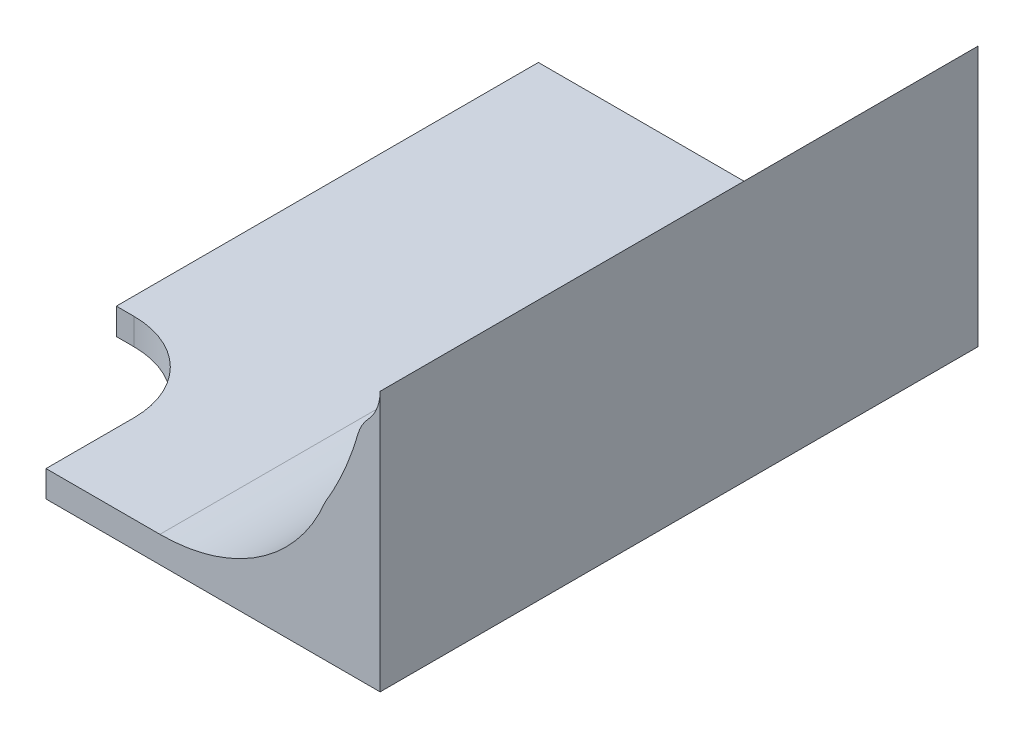
ISO-10303-21;
HEADER;
FILE_DESCRIPTION(('STEP AP214'),'2;1');
FILE_NAME('part.step','',(''),(''),'','','');
FILE_SCHEMA(('AUTOMOTIVE_DESIGN { 1 0 10303 214 1 1 1 1 }'));
ENDSEC;
DATA;
#1=APPLICATION_CONTEXT('core data for automotive mechanical design processes');
#2=APPLICATION_PROTOCOL_DEFINITION('international standard','automotive_design',2000,#1);
#3=PRODUCT_CONTEXT('',#1,'mechanical');
#4=PRODUCT('Part','Part','',(#3));
#5=PRODUCT_RELATED_PRODUCT_CATEGORY('part','',(#4));
#6=PRODUCT_DEFINITION_FORMATION('','',#4);
#7=PRODUCT_DEFINITION_CONTEXT('part definition',#1,'design');
#8=PRODUCT_DEFINITION('design','',#6,#7);
#9=PRODUCT_DEFINITION_SHAPE('','',#8);
#10=(LENGTH_UNIT() NAMED_UNIT(*) SI_UNIT(.MILLI.,.METRE.));
#11=(NAMED_UNIT(*) PLANE_ANGLE_UNIT() SI_UNIT($,.RADIAN.));
#12=(NAMED_UNIT(*) SI_UNIT($,.STERADIAN.) SOLID_ANGLE_UNIT());
#13=UNCERTAINTY_MEASURE_WITH_UNIT(LENGTH_MEASURE(1.E-05),#10,'distance_accuracy_value','');
#14=(GEOMETRIC_REPRESENTATION_CONTEXT(3) GLOBAL_UNCERTAINTY_ASSIGNED_CONTEXT((#13)) GLOBAL_UNIT_ASSIGNED_CONTEXT((#10,
#11,#12)) REPRESENTATION_CONTEXT('',''));
#15=CARTESIAN_POINT('',(0.,0.,0.));
#16=DIRECTION('',(0.,0.,1.));
#17=DIRECTION('',(1.,0.,0.));
#18=AXIS2_PLACEMENT_3D('',#15,#16,#17);
#19=CARTESIAN_POINT('',(-46.6570676342095,8.71991326429071,68.));
#20=DIRECTION('',(0.,0.,1.));
#21=DIRECTION('',(1.,0.,0.));
#22=AXIS2_PLACEMENT_3D('',#19,#20,#21);
#23=PLANE('',#22);
#24=DIRECTION('',(-1.,0.,0.));
#25=VECTOR('',#24,1.);
#26=CARTESIAN_POINT('',(-46.6570676342095,-11.6075992095853,68.));
#27=LINE('',#26,#25);
#28=CARTESIAN_POINT('',(-46.6570676342095,-11.6075992095853,68.));
#29=VERTEX_POINT('',#28);
#30=CARTESIAN_POINT('',(-59.6132819538857,-11.6075992095853,68.));
#31=VERTEX_POINT('',#30);
#32=EDGE_CURVE('E98',#29,#31,#27,.T.);
#33=ORIENTED_EDGE('',*,*,#32,.T.);
#34=DIRECTION('',(0.,-1.,0.));
#35=VECTOR('',#34,1.);
#36=CARTESIAN_POINT('',(-59.6132819538857,8.71991326429071,68.));
#37=LINE('',#36,#35);
#38=CARTESIAN_POINT('',(-59.6132819538857,-14.6072796615999,68.));
#39=VERTEX_POINT('',#38);
#40=EDGE_CURVE('E11',#31,#39,#37,.T.);
#41=ORIENTED_EDGE('',*,*,#40,.T.);
#42=DIRECTION('',(1.,0.,0.));
#43=VECTOR('',#42,1.);
#44=CARTESIAN_POINT('',(-71.6132819538857,-14.6072796615999,68.));
#45=LINE('',#44,#43);
#46=CARTESIAN_POINT('',(-21.6132819538857,-14.6072796615999,68.));
#47=VERTEX_POINT('',#46);
#48=EDGE_CURVE('E228',#39,#47,#45,.T.);
#49=ORIENTED_EDGE('',*,*,#48,.T.);
#50=DIRECTION('',(0.,1.,0.));
#51=VECTOR('',#50,1.);
#52=CARTESIAN_POINT('',(-21.6132819538857,15.0044366232111,68.));
#53=LINE('',#52,#51);
#54=CARTESIAN_POINT('',(-21.6132819538857,15.0044366232111,68.));
#55=VERTEX_POINT('',#54);
#56=EDGE_CURVE('E114',#47,#55,#53,.T.);
#57=ORIENTED_EDGE('',*,*,#56,.T.);
#58=CARTESIAN_POINT('',(-26.6132819538857,15.0044366232111,68.));
#59=DIRECTION('',(0.,0.,-1.));
#60=DIRECTION('',(1.,0.,0.));
#61=AXIS2_PLACEMENT_3D('',#58,#59,#60);
#62=CIRCLE('',#61,5.);
#63=CARTESIAN_POINT('',(-22.9706430344639,11.5793553537062,68.));
#64=VERTEX_POINT('',#63);
#65=EDGE_CURVE('E108',#55,#64,#62,.T.);
#66=ORIENTED_EDGE('',*,*,#65,.T.);
#67=CARTESIAN_POINT('',(-19.3280041150421,8.15427408420119,68.));
#68=DIRECTION('',(0.,0.,1.));
#69=DIRECTION('',(1.,0.,0.));
#70=AXIS2_PLACEMENT_3D('',#67,#68,#69);
#71=CIRCLE('',#70,5.);
#72=CARTESIAN_POINT('',(-24.1335290377381,9.53519052531834,68.));
#73=VERTEX_POINT('',#72);
#74=EDGE_CURVE('E111',#64,#73,#71,.T.);
#75=ORIENTED_EDGE('',*,*,#74,.T.);
#76=CARTESIAN_POINT('',(-58.5096656659944,19.4135228647991,68.));
#77=DIRECTION('',(0.,0.,-1.));
#78=DIRECTION('',(1.,0.,0.));
#79=AXIS2_PLACEMENT_3D('',#76,#77,#78);
#80=CIRCLE('',#79,35.7673065702993);
#81=CARTESIAN_POINT('',(-27.8660561362806,0.967129876352508,68.));
#82=VERTEX_POINT('',#81);
#83=EDGE_CURVE('E56',#73,#82,#80,.T.);
#84=ORIENTED_EDGE('',*,*,#83,.T.);
#85=CARTESIAN_POINT('',(-46.6570676342095,8.71991326429071,68.));
#86=DIRECTION('',(0.,0.,-1.));
#87=DIRECTION('',(1.,0.,0.));
#88=AXIS2_PLACEMENT_3D('',#85,#86,#87);
#89=CIRCLE('',#88,20.327512473876);
#90=EDGE_CURVE('E153',#82,#29,#89,.T.);
#91=ORIENTED_EDGE('',*,*,#90,.T.);
#92=EDGE_LOOP('',(#33,#41,#49,#57,#66,#75,#84,#91));
#93=FACE_BOUND('',#92,.T.);
#94=ADVANCED_FACE('F33',(#93),#23,.T.);
#95=CARTESIAN_POINT('',(-46.6570676342095,8.71991326429071,68.));
#96=DIRECTION('',(0.,0.,-1.));
#97=DIRECTION('',(-1.,0.,0.));
#98=AXIS2_PLACEMENT_3D('',#95,#96,#97);
#99=CYLINDRICAL_SURFACE('',#98,20.327512473876);
#100=CARTESIAN_POINT('',(-46.6570676342095,8.71991326429071,0.));
#101=DIRECTION('',(0.,0.,-1.));
#102=DIRECTION('',(1.,0.,0.));
#103=AXIS2_PLACEMENT_3D('',#100,#101,#102);
#104=CIRCLE('',#103,20.327512473876);
#105=CARTESIAN_POINT('',(-27.8660561362806,0.967129876352508,0.));
#106=VERTEX_POINT('',#105);
#107=CARTESIAN_POINT('',(-46.6570676342095,-11.6075992095853,0.));
#108=VERTEX_POINT('',#107);
#109=EDGE_CURVE('E135',#106,#108,#104,.T.);
#110=ORIENTED_EDGE('',*,*,#109,.T.);
#111=DIRECTION('',(0.,0.,-1.));
#112=VECTOR('',#111,1.);
#113=CARTESIAN_POINT('',(-46.6570676342095,-11.6075992095853,68.));
#114=LINE('',#113,#112);
#115=EDGE_CURVE('E41',#29,#108,#114,.T.);
#116=ORIENTED_EDGE('',*,*,#115,.F.);
#117=ORIENTED_EDGE('',*,*,#90,.F.);
#118=DIRECTION('',(0.,0.,-1.));
#119=VECTOR('',#118,1.);
#120=CARTESIAN_POINT('',(-27.8660561362806,0.967129876352508,68.));
#121=LINE('',#120,#119);
#122=EDGE_CURVE('E131',#82,#106,#121,.T.);
#123=ORIENTED_EDGE('',*,*,#122,.T.);
#124=EDGE_LOOP('',(#110,#116,#117,#123));
#125=FACE_BOUND('',#124,.T.);
#126=ADVANCED_FACE('F35',(#125),#99,.F.);
#127=CARTESIAN_POINT('',(-46.6570676342095,-11.6075992095853,68.));
#128=DIRECTION('',(0.,-1.,0.));
#129=DIRECTION('',(0.,0.,-1.));
#130=AXIS2_PLACEMENT_3D('',#127,#128,#129);
#131=PLANE('',#130);
#132=DIRECTION('',(0.,0.,-1.));
#133=VECTOR('',#132,1.);
#134=CARTESIAN_POINT('',(-71.6132819538857,-11.6075992095853,68.));
#135=LINE('',#134,#133);
#136=CARTESIAN_POINT('',(-71.6132819538857,-11.6075992095853,48.));
#137=VERTEX_POINT('',#136);
#138=CARTESIAN_POINT('',(-71.6132819538857,-11.6075992095853,0.));
#139=VERTEX_POINT('',#138);
#140=EDGE_CURVE('E162',#137,#139,#135,.T.);
#141=ORIENTED_EDGE('',*,*,#140,.F.);
#142=DIRECTION('',(1.,0.,0.));
#143=VECTOR('',#142,1.);
#144=CARTESIAN_POINT('',(-46.6570676342095,-11.6075992095853,48.));
#145=LINE('',#144,#143);
#146=CARTESIAN_POINT('',(-69.6132819538858,-11.6075992095853,48.));
#147=VERTEX_POINT('',#146);
#148=EDGE_CURVE('E139',#137,#147,#145,.T.);
#149=ORIENTED_EDGE('',*,*,#148,.T.);
#150=CARTESIAN_POINT('',(-69.6132819538857,-11.6075992095853,58.));
#151=DIRECTION('',(0.,-1.,0.));
#152=DIRECTION('',(0.,0.,-1.));
#153=AXIS2_PLACEMENT_3D('',#150,#151,#152);
#154=CIRCLE('',#153,9.99999999999999);
#155=CARTESIAN_POINT('',(-59.6132819538857,-11.6075992095853,58.0000000000001));
#156=VERTEX_POINT('',#155);
#157=EDGE_CURVE('E207',#147,#156,#154,.T.);
#158=ORIENTED_EDGE('',*,*,#157,.T.);
#159=DIRECTION('',(0.,0.,-1.));
#160=VECTOR('',#159,1.);
#161=CARTESIAN_POINT('',(-59.6132819538857,-11.6075992095853,68.));
#162=LINE('',#161,#160);
#163=EDGE_CURVE('E221',#31,#156,#162,.T.);
#164=ORIENTED_EDGE('',*,*,#163,.F.);
#165=ORIENTED_EDGE('',*,*,#32,.F.);
#166=ORIENTED_EDGE('',*,*,#115,.T.);
#167=DIRECTION('',(-1.,0.,0.));
#168=VECTOR('',#167,1.);
#169=CARTESIAN_POINT('',(-46.6570676342095,-11.6075992095853,0.));
#170=LINE('',#169,#168);
#171=EDGE_CURVE('E138',#108,#139,#170,.T.);
#172=ORIENTED_EDGE('',*,*,#171,.T.);
#173=EDGE_LOOP('',(#141,#149,#158,#164,#165,#166,#172));
#174=FACE_BOUND('',#173,.T.);
#175=ADVANCED_FACE('F165',(#174),#131,.F.);
#176=CARTESIAN_POINT('',(-71.6132819538857,-11.6075992095853,68.));
#177=DIRECTION('',(1.,0.,0.));
#178=DIRECTION('',(0.,0.,-1.));
#179=AXIS2_PLACEMENT_3D('',#176,#177,#178);
#180=PLANE('',#179);
#181=DIRECTION('',(0.,0.,-1.));
#182=VECTOR('',#181,1.);
#183=CARTESIAN_POINT('',(-71.6132819538857,-14.6072796615999,68.));
#184=LINE('',#183,#182);
#185=CARTESIAN_POINT('',(-71.6132819538857,-14.6072796615999,48.));
#186=VERTEX_POINT('',#185);
#187=CARTESIAN_POINT('',(-71.6132819538857,-14.6072796615999,0.));
#188=VERTEX_POINT('',#187);
#189=EDGE_CURVE('E160',#186,#188,#184,.T.);
#190=ORIENTED_EDGE('',*,*,#189,.F.);
#191=DIRECTION('',(0.,-1.,0.));
#192=VECTOR('',#191,1.);
#193=CARTESIAN_POINT('',(-71.6132819538857,-4.60727966159988,48.));
#194=LINE('',#193,#192);
#195=EDGE_CURVE('E181',#137,#186,#194,.T.);
#196=ORIENTED_EDGE('',*,*,#195,.F.);
#197=ORIENTED_EDGE('',*,*,#140,.T.);
#198=DIRECTION('',(0.,-1.,0.));
#199=VECTOR('',#198,1.);
#200=CARTESIAN_POINT('',(-71.6132819538857,-11.6075992095853,0.));
#201=LINE('',#200,#199);
#202=EDGE_CURVE('E142',#139,#188,#201,.T.);
#203=ORIENTED_EDGE('',*,*,#202,.T.);
#204=EDGE_LOOP('',(#190,#196,#197,#203));
#205=FACE_BOUND('',#204,.T.);
#206=ADVANCED_FACE('F176',(#205),#180,.F.);
#207=CARTESIAN_POINT('',(-71.6132819538857,-14.6072796615999,68.));
#208=DIRECTION('',(0.,1.,0.));
#209=DIRECTION('',(-1.,0.,0.));
#210=AXIS2_PLACEMENT_3D('',#207,#208,#209);
#211=PLANE('',#210);
#212=CARTESIAN_POINT('',(-69.6132819538857,-14.6072796615999,58.));
#213=DIRECTION('',(0.,-1.,0.));
#214=DIRECTION('',(1.,0.,0.));
#215=AXIS2_PLACEMENT_3D('',#212,#213,#214);
#216=CIRCLE('',#215,9.99999999999999);
#217=CARTESIAN_POINT('',(-69.6132819538858,-14.6072796615999,48.));
#218=VERTEX_POINT('',#217);
#219=CARTESIAN_POINT('',(-59.6132819538857,-14.6072796615999,58.0000000000001));
#220=VERTEX_POINT('',#219);
#221=EDGE_CURVE('E206',#218,#220,#216,.T.);
#222=ORIENTED_EDGE('',*,*,#221,.F.);
#223=DIRECTION('',(1.,0.,0.));
#224=VECTOR('',#223,1.);
#225=CARTESIAN_POINT('',(-71.6132819538857,-14.6072796615999,48.));
#226=LINE('',#225,#224);
#227=EDGE_CURVE('E211',#186,#218,#226,.T.);
#228=ORIENTED_EDGE('',*,*,#227,.F.);
#229=ORIENTED_EDGE('',*,*,#189,.T.);
#230=DIRECTION('',(1.,0.,0.));
#231=VECTOR('',#230,1.);
#232=CARTESIAN_POINT('',(-71.6132819538857,-14.6072796615999,0.));
#233=LINE('',#232,#231);
#234=CARTESIAN_POINT('',(-21.6132819538857,-14.6072796615999,0.));
#235=VERTEX_POINT('',#234);
#236=EDGE_CURVE('E145',#188,#235,#233,.T.);
#237=ORIENTED_EDGE('',*,*,#236,.T.);
#238=DIRECTION('',(0.,0.,-1.));
#239=VECTOR('',#238,1.);
#240=CARTESIAN_POINT('',(-21.6132819538857,-14.6072796615999,68.));
#241=LINE('',#240,#239);
#242=EDGE_CURVE('E157',#47,#235,#241,.T.);
#243=ORIENTED_EDGE('',*,*,#242,.F.);
#244=ORIENTED_EDGE('',*,*,#48,.F.);
#245=DIRECTION('',(0.,0.,-1.));
#246=VECTOR('',#245,1.);
#247=CARTESIAN_POINT('',(-59.6132819538857,-14.6072796615999,68.));
#248=LINE('',#247,#246);
#249=EDGE_CURVE('E48',#39,#220,#248,.T.);
#250=ORIENTED_EDGE('',*,*,#249,.T.);
#251=EDGE_LOOP('',(#222,#228,#229,#237,#243,#244,#250));
#252=FACE_BOUND('',#251,.T.);
#253=ADVANCED_FACE('F215',(#252),#211,.F.);
#254=CARTESIAN_POINT('',(-21.6132819538857,15.0044366232111,68.));
#255=DIRECTION('',(-1.,0.,0.));
#256=DIRECTION('',(0.,-1.,0.));
#257=AXIS2_PLACEMENT_3D('',#254,#255,#256);
#258=PLANE('',#257);
#259=DIRECTION('',(0.,1.,0.));
#260=VECTOR('',#259,1.);
#261=CARTESIAN_POINT('',(-21.6132819538857,15.0044366232111,0.));
#262=LINE('',#261,#260);
#263=CARTESIAN_POINT('',(-21.6132819538857,15.0044366232111,0.));
#264=VERTEX_POINT('',#263);
#265=EDGE_CURVE('E147',#235,#264,#262,.T.);
#266=ORIENTED_EDGE('',*,*,#265,.T.);
#267=DIRECTION('',(0.,0.,-1.));
#268=VECTOR('',#267,1.);
#269=CARTESIAN_POINT('',(-21.6132819538857,15.0044366232111,68.));
#270=LINE('',#269,#268);
#271=EDGE_CURVE('E126',#55,#264,#270,.T.);
#272=ORIENTED_EDGE('',*,*,#271,.F.);
#273=ORIENTED_EDGE('',*,*,#56,.F.);
#274=ORIENTED_EDGE('',*,*,#242,.T.);
#275=EDGE_LOOP('',(#266,#272,#273,#274));
#276=FACE_BOUND('',#275,.T.);
#277=ADVANCED_FACE('F231',(#276),#258,.F.);
#278=CARTESIAN_POINT('',(-26.6132819538857,15.0044366232111,68.));
#279=DIRECTION('',(0.,0.,-1.));
#280=DIRECTION('',(-1.,0.,0.));
#281=AXIS2_PLACEMENT_3D('',#278,#279,#280);
#282=CYLINDRICAL_SURFACE('',#281,5.);
#283=CARTESIAN_POINT('',(-26.6132819538857,15.0044366232111,0.));
#284=DIRECTION('',(0.,0.,-1.));
#285=DIRECTION('',(1.,0.,0.));
#286=AXIS2_PLACEMENT_3D('',#283,#284,#285);
#287=CIRCLE('',#286,5.);
#288=CARTESIAN_POINT('',(-22.9706430344639,11.5793553537062,0.));
#289=VERTEX_POINT('',#288);
#290=EDGE_CURVE('E123',#264,#289,#287,.T.);
#291=ORIENTED_EDGE('',*,*,#290,.T.);
#292=DIRECTION('',(0.,0.,-1.));
#293=VECTOR('',#292,1.);
#294=CARTESIAN_POINT('',(-22.9706430344639,11.5793553537062,68.));
#295=LINE('',#294,#293);
#296=EDGE_CURVE('E120',#64,#289,#295,.T.);
#297=ORIENTED_EDGE('',*,*,#296,.F.);
#298=ORIENTED_EDGE('',*,*,#65,.F.);
#299=ORIENTED_EDGE('',*,*,#271,.T.);
#300=EDGE_LOOP('',(#291,#297,#298,#299));
#301=FACE_BOUND('',#300,.T.);
#302=ADVANCED_FACE('F121',(#301),#282,.F.);
#303=CARTESIAN_POINT('',(-19.3280041150421,8.15427408420119,68.));
#304=DIRECTION('',(0.,0.,-1.));
#305=DIRECTION('',(-1.,0.,0.));
#306=AXIS2_PLACEMENT_3D('',#303,#304,#305);
#307=CYLINDRICAL_SURFACE('',#306,5.);
#308=CARTESIAN_POINT('',(-19.3280041150421,8.15427408420119,0.));
#309=DIRECTION('',(0.,0.,1.));
#310=DIRECTION('',(1.,0.,0.));
#311=AXIS2_PLACEMENT_3D('',#308,#309,#310);
#312=CIRCLE('',#311,5.);
#313=CARTESIAN_POINT('',(-24.1335290377381,9.53519052531834,0.));
#314=VERTEX_POINT('',#313);
#315=EDGE_CURVE('E150',#289,#314,#312,.T.);
#316=ORIENTED_EDGE('',*,*,#315,.T.);
#317=DIRECTION('',(0.,0.,-1.));
#318=VECTOR('',#317,1.);
#319=CARTESIAN_POINT('',(-24.1335290377381,9.53519052531834,68.));
#320=LINE('',#319,#318);
#321=EDGE_CURVE('E127',#73,#314,#320,.T.);
#322=ORIENTED_EDGE('',*,*,#321,.F.);
#323=ORIENTED_EDGE('',*,*,#74,.F.);
#324=ORIENTED_EDGE('',*,*,#296,.T.);
#325=EDGE_LOOP('',(#316,#322,#323,#324));
#326=FACE_BOUND('',#325,.T.);
#327=ADVANCED_FACE('F129',(#326),#307,.T.);
#328=CARTESIAN_POINT('',(-58.5096656659944,19.4135228647991,68.));
#329=DIRECTION('',(0.,0.,-1.));
#330=DIRECTION('',(-1.,0.,0.));
#331=AXIS2_PLACEMENT_3D('',#328,#329,#330);
#332=CYLINDRICAL_SURFACE('',#331,35.7673065702993);
#333=CARTESIAN_POINT('',(-58.5096656659944,19.4135228647991,0.));
#334=DIRECTION('',(0.,0.,-1.));
#335=DIRECTION('',(1.,0.,0.));
#336=AXIS2_PLACEMENT_3D('',#333,#334,#335);
#337=CIRCLE('',#336,35.7673065702993);
#338=EDGE_CURVE('E89',#314,#106,#337,.T.);
#339=ORIENTED_EDGE('',*,*,#338,.T.);
#340=ORIENTED_EDGE('',*,*,#122,.F.);
#341=ORIENTED_EDGE('',*,*,#83,.F.);
#342=ORIENTED_EDGE('',*,*,#321,.T.);
#343=EDGE_LOOP('',(#339,#340,#341,#342));
#344=FACE_BOUND('',#343,.T.);
#345=ADVANCED_FACE('F232',(#344),#332,.F.);
#346=CARTESIAN_POINT('',(-46.6570676342095,8.71991326429071,0.));
#347=DIRECTION('',(0.,0.,1.));
#348=DIRECTION('',(1.,0.,0.));
#349=AXIS2_PLACEMENT_3D('',#346,#347,#348);
#350=PLANE('',#349);
#351=ORIENTED_EDGE('',*,*,#109,.F.);
#352=ORIENTED_EDGE('',*,*,#338,.F.);
#353=ORIENTED_EDGE('',*,*,#315,.F.);
#354=ORIENTED_EDGE('',*,*,#290,.F.);
#355=ORIENTED_EDGE('',*,*,#265,.F.);
#356=ORIENTED_EDGE('',*,*,#236,.F.);
#357=ORIENTED_EDGE('',*,*,#202,.F.);
#358=ORIENTED_EDGE('',*,*,#171,.F.);
#359=EDGE_LOOP('',(#351,#352,#353,#354,#355,#356,#357,#358));
#360=FACE_BOUND('',#359,.T.);
#361=ADVANCED_FACE('F171',(#360),#350,.F.);
#362=CARTESIAN_POINT('',(-71.6132819538857,-4.60727966159988,48.));
#363=DIRECTION('',(0.,0.,-1.));
#364=DIRECTION('',(-1.,0.,0.));
#365=AXIS2_PLACEMENT_3D('',#362,#363,#364);
#366=PLANE('',#365);
#367=ORIENTED_EDGE('',*,*,#195,.T.);
#368=ORIENTED_EDGE('',*,*,#227,.T.);
#369=DIRECTION('',(0.,-1.,0.));
#370=VECTOR('',#369,1.);
#371=CARTESIAN_POINT('',(-69.6132819538858,-4.60727966159988,48.));
#372=LINE('',#371,#370);
#373=EDGE_CURVE('E201',#147,#218,#372,.T.);
#374=ORIENTED_EDGE('',*,*,#373,.F.);
#375=ORIENTED_EDGE('',*,*,#148,.F.);
#376=EDGE_LOOP('',(#367,#368,#374,#375));
#377=FACE_BOUND('',#376,.T.);
#378=ADVANCED_FACE('F212',(#377),#366,.F.);
#379=CARTESIAN_POINT('',(-69.6132819538857,-4.60727966159988,58.));
#380=DIRECTION('',(0.,-1.,0.));
#381=DIRECTION('',(1.,0.,0.));
#382=AXIS2_PLACEMENT_3D('',#379,#380,#381);
#383=CYLINDRICAL_SURFACE('',#382,9.99999999999999);
#384=ORIENTED_EDGE('',*,*,#373,.T.);
#385=ORIENTED_EDGE('',*,*,#221,.T.);
#386=DIRECTION('',(0.,-1.,0.));
#387=VECTOR('',#386,1.);
#388=CARTESIAN_POINT('',(-59.6132819538857,-4.60727966159988,58.0000000000001));
#389=LINE('',#388,#387);
#390=EDGE_CURVE('E208',#156,#220,#389,.T.);
#391=ORIENTED_EDGE('',*,*,#390,.F.);
#392=ORIENTED_EDGE('',*,*,#157,.F.);
#393=EDGE_LOOP('',(#384,#385,#391,#392));
#394=FACE_BOUND('',#393,.T.);
#395=ADVANCED_FACE('F203',(#394),#383,.F.);
#396=CARTESIAN_POINT('',(-59.6132819538857,-4.60727966159988,68.));
#397=DIRECTION('',(-1.,0.,0.));
#398=DIRECTION('',(0.,-1.,0.));
#399=AXIS2_PLACEMENT_3D('',#396,#397,#398);
#400=PLANE('',#399);
#401=ORIENTED_EDGE('',*,*,#163,.T.);
#402=ORIENTED_EDGE('',*,*,#390,.T.);
#403=ORIENTED_EDGE('',*,*,#249,.F.);
#404=ORIENTED_EDGE('',*,*,#40,.F.);
#405=EDGE_LOOP('',(#401,#402,#403,#404));
#406=FACE_BOUND('',#405,.T.);
#407=ADVANCED_FACE('F251',(#406),#400,.T.);
#408=CLOSED_SHELL('',(#94,#126,#175,#206,#253,#277,#302,#327,#345,#361,#378,#395,#407));
#409=MANIFOLD_SOLID_BREP('B2',#408);
#410=ADVANCED_BREP_SHAPE_REPRESENTATION('',(#18,#409),#14);
#411=SHAPE_DEFINITION_REPRESENTATION(#9,#410);
ENDSEC;
END-ISO-10303-21;
